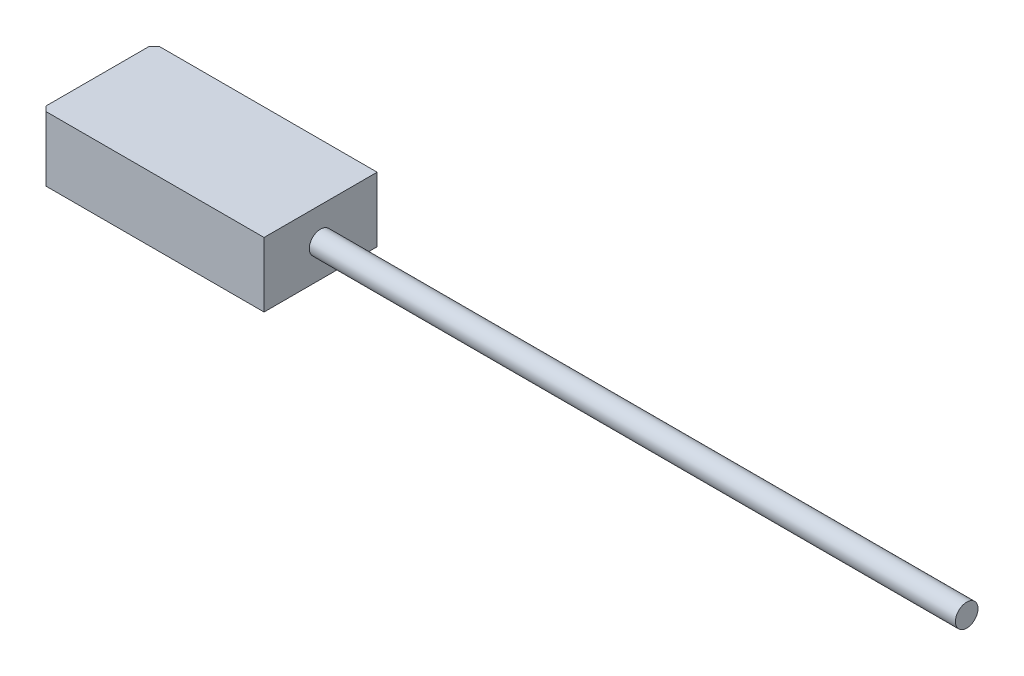
ISO-10303-21;
HEADER;
FILE_DESCRIPTION(('STEP AP214'),'2;1');
FILE_NAME('part.step','',(''),(''),'','','');
FILE_SCHEMA(('AUTOMOTIVE_DESIGN { 1 0 10303 214 1 1 1 1 }'));
ENDSEC;
DATA;
#1=APPLICATION_CONTEXT('core data for automotive mechanical design processes');
#2=APPLICATION_PROTOCOL_DEFINITION('international standard','automotive_design',2000,#1);
#3=PRODUCT_CONTEXT('',#1,'mechanical');
#4=PRODUCT('Part','Part','',(#3));
#5=PRODUCT_RELATED_PRODUCT_CATEGORY('part','',(#4));
#6=PRODUCT_DEFINITION_FORMATION('','',#4);
#7=PRODUCT_DEFINITION_CONTEXT('part definition',#1,'design');
#8=PRODUCT_DEFINITION('design','',#6,#7);
#9=PRODUCT_DEFINITION_SHAPE('','',#8);
#10=(LENGTH_UNIT() NAMED_UNIT(*) SI_UNIT(.MILLI.,.METRE.));
#11=(NAMED_UNIT(*) PLANE_ANGLE_UNIT() SI_UNIT($,.RADIAN.));
#12=(NAMED_UNIT(*) SI_UNIT($,.STERADIAN.) SOLID_ANGLE_UNIT());
#13=UNCERTAINTY_MEASURE_WITH_UNIT(LENGTH_MEASURE(1.E-05),#10,'distance_accuracy_value','');
#14=(GEOMETRIC_REPRESENTATION_CONTEXT(3) GLOBAL_UNCERTAINTY_ASSIGNED_CONTEXT((#13)) GLOBAL_UNIT_ASSIGNED_CONTEXT((#10,
#11,#12)) REPRESENTATION_CONTEXT('',''));
#15=CARTESIAN_POINT('',(0.,0.,0.));
#16=DIRECTION('',(0.,0.,1.));
#17=DIRECTION('',(1.,0.,0.));
#18=AXIS2_PLACEMENT_3D('',#15,#16,#17);
#19=CARTESIAN_POINT('',(1.5,-0.2,-0.35));
#20=DIRECTION('',(0.,0.,1.));
#21=DIRECTION('',(1.,0.,0.));
#22=AXIS2_PLACEMENT_3D('',#19,#20,#21);
#23=PLANE('',#22);
#24=DIRECTION('',(-1.,0.,0.));
#25=VECTOR('',#24,1.);
#26=CARTESIAN_POINT('',(1.5,-0.2,-0.35));
#27=LINE('',#26,#25);
#28=CARTESIAN_POINT('',(1.5,-0.2,-0.35));
#29=VERTEX_POINT('',#28);
#30=CARTESIAN_POINT('',(0.15,-0.2,-0.35));
#31=VERTEX_POINT('',#30);
#32=EDGE_CURVE('E210',#29,#31,#27,.T.);
#33=ORIENTED_EDGE('',*,*,#32,.T.);
#34=DIRECTION('',(0.,1.,0.));
#35=VECTOR('',#34,1.);
#36=CARTESIAN_POINT('',(0.15,0.0800000000000013,-0.35));
#37=LINE('',#36,#35);
#38=CARTESIAN_POINT('',(0.15,0.2,-0.35));
#39=VERTEX_POINT('',#38);
#40=EDGE_CURVE('E11',#31,#39,#37,.T.);
#41=ORIENTED_EDGE('',*,*,#40,.T.);
#42=DIRECTION('',(-1.,0.,0.));
#43=VECTOR('',#42,1.);
#44=CARTESIAN_POINT('',(1.5,0.2,-0.35));
#45=LINE('',#44,#43);
#46=CARTESIAN_POINT('',(1.5,0.2,-0.35));
#47=VERTEX_POINT('',#46);
#48=EDGE_CURVE('E117',#47,#39,#45,.T.);
#49=ORIENTED_EDGE('',*,*,#48,.F.);
#50=DIRECTION('',(0.,1.,0.));
#51=VECTOR('',#50,1.);
#52=CARTESIAN_POINT('',(1.5,-0.2,-0.35));
#53=LINE('',#52,#51);
#54=EDGE_CURVE('E124',#29,#47,#53,.T.);
#55=ORIENTED_EDGE('',*,*,#54,.F.);
#56=EDGE_LOOP('',(#33,#41,#49,#55));
#57=FACE_BOUND('',#56,.T.);
#58=ADVANCED_FACE('F44',(#57),#23,.F.);
#59=CARTESIAN_POINT('',(1.5,0.2,0.35));
#60=DIRECTION('',(0.,-1.,0.));
#61=DIRECTION('',(0.,0.,-1.));
#62=AXIS2_PLACEMENT_3D('',#59,#60,#61);
#63=PLANE('',#62);
#64=DIRECTION('',(0.,0.,1.));
#65=VECTOR('',#64,1.);
#66=CARTESIAN_POINT('',(0.119999999999999,0.2,0.35));
#67=LINE('',#66,#65);
#68=CARTESIAN_POINT('',(0.119999999999999,0.2,-0.319999999999998));
#69=VERTEX_POINT('',#68);
#70=CARTESIAN_POINT('',(0.119999999999999,0.2,0.319999999999998));
#71=VERTEX_POINT('',#70);
#72=EDGE_CURVE('E159',#69,#71,#67,.T.);
#73=ORIENTED_EDGE('',*,*,#72,.T.);
#74=DIRECTION('',(0.707106781186546,0.,0.70710678118655));
#75=VECTOR('',#74,1.);
#76=CARTESIAN_POINT('',(0.15,0.2,0.35));
#77=LINE('',#76,#75);
#78=CARTESIAN_POINT('',(0.15,0.2,0.35));
#79=VERTEX_POINT('',#78);
#80=EDGE_CURVE('E54',#71,#79,#77,.T.);
#81=ORIENTED_EDGE('',*,*,#80,.T.);
#82=DIRECTION('',(-1.,0.,0.));
#83=VECTOR('',#82,1.);
#84=CARTESIAN_POINT('',(1.5,0.2,0.35));
#85=LINE('',#84,#83);
#86=CARTESIAN_POINT('',(1.5,0.2,0.35));
#87=VERTEX_POINT('',#86);
#88=EDGE_CURVE('E119',#87,#79,#85,.T.);
#89=ORIENTED_EDGE('',*,*,#88,.F.);
#90=DIRECTION('',(0.,0.,1.));
#91=VECTOR('',#90,1.);
#92=CARTESIAN_POINT('',(1.5,0.2,0.35));
#93=LINE('',#92,#91);
#94=EDGE_CURVE('E113',#47,#87,#93,.T.);
#95=ORIENTED_EDGE('',*,*,#94,.F.);
#96=ORIENTED_EDGE('',*,*,#48,.T.);
#97=DIRECTION('',(-0.707106781186546,0.,0.70710678118655));
#98=VECTOR('',#97,1.);
#99=CARTESIAN_POINT('',(0.15,0.2,-0.35));
#100=LINE('',#99,#98);
#101=EDGE_CURVE('E61',#39,#69,#100,.T.);
#102=ORIENTED_EDGE('',*,*,#101,.T.);
#103=EDGE_LOOP('',(#73,#81,#89,#95,#96,#102));
#104=FACE_BOUND('',#103,.T.);
#105=ADVANCED_FACE('F115',(#104),#63,.F.);
#106=CARTESIAN_POINT('',(1.5,-0.2,0.35));
#107=DIRECTION('',(0.,0.,-1.));
#108=DIRECTION('',(-1.,0.,0.));
#109=AXIS2_PLACEMENT_3D('',#106,#107,#108);
#110=PLANE('',#109);
#111=ORIENTED_EDGE('',*,*,#88,.T.);
#112=DIRECTION('',(0.,-1.,0.));
#113=VECTOR('',#112,1.);
#114=CARTESIAN_POINT('',(0.15,-0.0800000000000005,0.35));
#115=LINE('',#114,#113);
#116=CARTESIAN_POINT('',(0.15,-0.2,0.35));
#117=VERTEX_POINT('',#116);
#118=EDGE_CURVE('E162',#79,#117,#115,.T.);
#119=ORIENTED_EDGE('',*,*,#118,.T.);
#120=DIRECTION('',(-1.,0.,0.));
#121=VECTOR('',#120,1.);
#122=CARTESIAN_POINT('',(1.5,-0.2,0.35));
#123=LINE('',#122,#121);
#124=CARTESIAN_POINT('',(1.5,-0.2,0.35));
#125=VERTEX_POINT('',#124);
#126=EDGE_CURVE('E144',#125,#117,#123,.T.);
#127=ORIENTED_EDGE('',*,*,#126,.F.);
#128=DIRECTION('',(0.,-1.,0.));
#129=VECTOR('',#128,1.);
#130=CARTESIAN_POINT('',(1.5,-0.2,0.35));
#131=LINE('',#130,#129);
#132=EDGE_CURVE('E123',#87,#125,#131,.T.);
#133=ORIENTED_EDGE('',*,*,#132,.F.);
#134=EDGE_LOOP('',(#111,#119,#127,#133));
#135=FACE_BOUND('',#134,.T.);
#136=ADVANCED_FACE('F195',(#135),#110,.F.);
#137=CARTESIAN_POINT('',(1.5,-0.2,0.35));
#138=DIRECTION('',(0.,1.,0.));
#139=DIRECTION('',(0.,0.,1.));
#140=AXIS2_PLACEMENT_3D('',#137,#138,#139);
#141=PLANE('',#140);
#142=ORIENTED_EDGE('',*,*,#126,.T.);
#143=DIRECTION('',(-0.707106781186546,0.,-0.70710678118655));
#144=VECTOR('',#143,1.);
#145=CARTESIAN_POINT('',(0.15,-0.2,0.35));
#146=LINE('',#145,#144);
#147=CARTESIAN_POINT('',(0.119999999999999,-0.2,0.319999999999999));
#148=VERTEX_POINT('',#147);
#149=EDGE_CURVE('E169',#117,#148,#146,.T.);
#150=ORIENTED_EDGE('',*,*,#149,.T.);
#151=DIRECTION('',(0.,0.,-1.));
#152=VECTOR('',#151,1.);
#153=CARTESIAN_POINT('',(0.119999999999999,-0.2,-0.35));
#154=LINE('',#153,#152);
#155=CARTESIAN_POINT('',(0.119999999999999,-0.2,-0.319999999999999));
#156=VERTEX_POINT('',#155);
#157=EDGE_CURVE('E142',#148,#156,#154,.T.);
#158=ORIENTED_EDGE('',*,*,#157,.T.);
#159=DIRECTION('',(0.707106781186546,0.,-0.70710678118655));
#160=VECTOR('',#159,1.);
#161=CARTESIAN_POINT('',(0.15,-0.2,-0.35));
#162=LINE('',#161,#160);
#163=EDGE_CURVE('E166',#156,#31,#162,.T.);
#164=ORIENTED_EDGE('',*,*,#163,.T.);
#165=ORIENTED_EDGE('',*,*,#32,.F.);
#166=DIRECTION('',(0.,0.,-1.));
#167=VECTOR('',#166,1.);
#168=CARTESIAN_POINT('',(1.5,-0.2,0.35));
#169=LINE('',#168,#167);
#170=EDGE_CURVE('E129',#125,#29,#169,.T.);
#171=ORIENTED_EDGE('',*,*,#170,.F.);
#172=EDGE_LOOP('',(#142,#150,#158,#164,#165,#171));
#173=FACE_BOUND('',#172,.T.);
#174=ADVANCED_FACE('F203',(#173),#141,.F.);
#175=CARTESIAN_POINT('',(1.5,0.,0.));
#176=DIRECTION('',(-1.,0.,0.));
#177=DIRECTION('',(0.,0.,1.));
#178=AXIS2_PLACEMENT_3D('',#175,#176,#177);
#179=PLANE('',#178);
#180=CARTESIAN_POINT('',(1.5,0.,0.));
#181=DIRECTION('',(1.,0.,0.));
#182=DIRECTION('',(0.,0.,-1.));
#183=AXIS2_PLACEMENT_3D('',#180,#181,#182);
#184=CIRCLE('',#183,0.07);
#185=CARTESIAN_POINT('',(1.5,0.,-0.07));
#186=VERTEX_POINT('',#185);
#187=EDGE_CURVE('E137',#186,#186,#184,.T.);
#188=ORIENTED_EDGE('',*,*,#187,.F.);
#189=EDGE_LOOP('',(#188));
#190=FACE_BOUND('',#189,.T.);
#191=ORIENTED_EDGE('',*,*,#54,.T.);
#192=ORIENTED_EDGE('',*,*,#94,.T.);
#193=ORIENTED_EDGE('',*,*,#132,.T.);
#194=ORIENTED_EDGE('',*,*,#170,.T.);
#195=EDGE_LOOP('',(#191,#192,#193,#194));
#196=FACE_BOUND('',#195,.T.);
#197=ADVANCED_FACE('F127',(#190,#196),#179,.F.);
#198=CARTESIAN_POINT('',(0.,0.,0.));
#199=DIRECTION('',(-1.,0.,0.));
#200=DIRECTION('',(0.,0.,1.));
#201=AXIS2_PLACEMENT_3D('',#198,#199,#200);
#202=PLANE('',#201);
#203=DIRECTION('',(0.,0.,1.));
#204=VECTOR('',#203,1.);
#205=CARTESIAN_POINT('',(0.,-0.0800000000000005,0.35));
#206=LINE('',#205,#204);
#207=CARTESIAN_POINT('',(0.,-0.0800000000000005,-0.199999999999999));
#208=VERTEX_POINT('',#207);
#209=CARTESIAN_POINT('',(0.,-0.0800000000000005,0.199999999999999));
#210=VERTEX_POINT('',#209);
#211=EDGE_CURVE('E155',#208,#210,#206,.T.);
#212=ORIENTED_EDGE('',*,*,#211,.T.);
#213=DIRECTION('',(0.,1.,0.));
#214=VECTOR('',#213,1.);
#215=CARTESIAN_POINT('',(0.,0.0800000000000013,0.199999999999999));
#216=LINE('',#215,#214);
#217=CARTESIAN_POINT('',(0.,0.0800000000000015,0.199999999999999));
#218=VERTEX_POINT('',#217);
#219=EDGE_CURVE('E181',#210,#218,#216,.T.);
#220=ORIENTED_EDGE('',*,*,#219,.T.);
#221=DIRECTION('',(0.,0.,-1.));
#222=VECTOR('',#221,1.);
#223=CARTESIAN_POINT('',(0.,0.0800000000000015,-0.35));
#224=LINE('',#223,#222);
#225=CARTESIAN_POINT('',(0.,0.0800000000000015,-0.199999999999999));
#226=VERTEX_POINT('',#225);
#227=EDGE_CURVE('E151',#218,#226,#224,.T.);
#228=ORIENTED_EDGE('',*,*,#227,.T.);
#229=DIRECTION('',(0.,-1.,0.));
#230=VECTOR('',#229,1.);
#231=CARTESIAN_POINT('',(0.,-0.0800000000000005,-0.199999999999999));
#232=LINE('',#231,#230);
#233=EDGE_CURVE('E178',#226,#208,#232,.T.);
#234=ORIENTED_EDGE('',*,*,#233,.T.);
#235=EDGE_LOOP('',(#212,#220,#228,#234));
#236=FACE_BOUND('',#235,.T.);
#237=ADVANCED_FACE('F228',(#236),#202,.T.);
#238=CARTESIAN_POINT('',(5.5,0.,0.));
#239=DIRECTION('',(-1.,0.,0.));
#240=DIRECTION('',(0.,0.,1.));
#241=AXIS2_PLACEMENT_3D('',#238,#239,#240);
#242=CYLINDRICAL_SURFACE('',#241,0.07);
#243=CARTESIAN_POINT('',(5.5,0.,0.));
#244=DIRECTION('',(1.,0.,0.));
#245=DIRECTION('',(0.,0.,-1.));
#246=AXIS2_PLACEMENT_3D('',#243,#244,#245);
#247=CIRCLE('',#246,0.07);
#248=CARTESIAN_POINT('',(5.5,0.,-0.07));
#249=VERTEX_POINT('',#248);
#250=EDGE_CURVE('E134',#249,#249,#247,.T.);
#251=ORIENTED_EDGE('',*,*,#250,.F.);
#252=EDGE_LOOP('',(#251));
#253=FACE_BOUND('',#252,.T.);
#254=ORIENTED_EDGE('',*,*,#187,.T.);
#255=EDGE_LOOP('',(#254));
#256=FACE_BOUND('',#255,.T.);
#257=ADVANCED_FACE('F225',(#253,#256),#242,.T.);
#258=CARTESIAN_POINT('',(5.5,0.,0.));
#259=DIRECTION('',(1.,0.,0.));
#260=DIRECTION('',(0.,0.,-1.));
#261=AXIS2_PLACEMENT_3D('',#258,#259,#260);
#262=PLANE('',#261);
#263=ORIENTED_EDGE('',*,*,#250,.T.);
#264=EDGE_LOOP('',(#263));
#265=FACE_BOUND('',#264,.T.);
#266=ADVANCED_FACE('F223',(#265),#262,.T.);
#267=CARTESIAN_POINT('',(0.119999999999999,-0.2,0.35));
#268=DIRECTION('',(-0.707106781186547,-0.707106781186547,0.));
#269=DIRECTION('',(0.,0.,1.));
#270=AXIS2_PLACEMENT_3D('',#267,#268,#269);
#271=PLANE('',#270);
#272=ORIENTED_EDGE('',*,*,#157,.F.);
#273=DIRECTION('',(-0.577350269189625,0.577350269189625,-0.577350269189628));
#274=VECTOR('',#273,1.);
#275=CARTESIAN_POINT('',(0.13,-0.21,0.33));
#276=LINE('',#275,#274);
#277=EDGE_CURVE('E175',#148,#210,#276,.T.);
#278=ORIENTED_EDGE('',*,*,#277,.T.);
#279=ORIENTED_EDGE('',*,*,#211,.F.);
#280=DIRECTION('',(0.577350269189625,-0.577350269189625,-0.577350269189628));
#281=VECTOR('',#280,1.);
#282=CARTESIAN_POINT('',(-0.103333333333334,0.0233333333333336,-0.0966666666666645));
#283=LINE('',#282,#281);
#284=EDGE_CURVE('E172',#208,#156,#283,.T.);
#285=ORIENTED_EDGE('',*,*,#284,.T.);
#286=EDGE_LOOP('',(#272,#278,#279,#285));
#287=FACE_BOUND('',#286,.T.);
#288=ADVANCED_FACE('F206',(#287),#271,.T.);
#289=CARTESIAN_POINT('',(0.119999999999999,0.2,0.35));
#290=DIRECTION('',(-0.707106781186548,0.707106781186548,0.));
#291=DIRECTION('',(0.,0.,-1.));
#292=AXIS2_PLACEMENT_3D('',#289,#290,#291);
#293=PLANE('',#292);
#294=ORIENTED_EDGE('',*,*,#227,.F.);
#295=DIRECTION('',(0.577350269189625,0.577350269189625,0.577350269189628));
#296=VECTOR('',#295,1.);
#297=CARTESIAN_POINT('',(0.129999999999999,0.210000000000001,0.329999999999999));
#298=LINE('',#297,#296);
#299=EDGE_CURVE('E68',#218,#71,#298,.T.);
#300=ORIENTED_EDGE('',*,*,#299,.T.);
#301=ORIENTED_EDGE('',*,*,#72,.F.);
#302=DIRECTION('',(-0.577350269189625,-0.577350269189625,0.577350269189628));
#303=VECTOR('',#302,1.);
#304=CARTESIAN_POINT('',(-0.103333333333335,-0.0233333333333332,-0.0966666666666639));
#305=LINE('',#304,#303);
#306=EDGE_CURVE('E184',#69,#226,#305,.T.);
#307=ORIENTED_EDGE('',*,*,#306,.T.);
#308=EDGE_LOOP('',(#294,#300,#301,#307));
#309=FACE_BOUND('',#308,.T.);
#310=ADVANCED_FACE('F255',(#309),#293,.T.);
#311=CARTESIAN_POINT('',(0.15,-0.2,0.35));
#312=DIRECTION('',(-0.70710678118655,0.,0.707106781186546));
#313=DIRECTION('',(0.,1.,0.));
#314=AXIS2_PLACEMENT_3D('',#311,#312,#313);
#315=PLANE('',#314);
#316=ORIENTED_EDGE('',*,*,#299,.F.);
#317=ORIENTED_EDGE('',*,*,#219,.F.);
#318=ORIENTED_EDGE('',*,*,#277,.F.);
#319=ORIENTED_EDGE('',*,*,#149,.F.);
#320=ORIENTED_EDGE('',*,*,#118,.F.);
#321=ORIENTED_EDGE('',*,*,#80,.F.);
#322=EDGE_LOOP('',(#316,#317,#318,#319,#320,#321));
#323=FACE_BOUND('',#322,.T.);
#324=ADVANCED_FACE('F198',(#323),#315,.T.);
#325=CARTESIAN_POINT('',(0.15,-0.2,-0.35));
#326=DIRECTION('',(-0.70710678118655,0.,-0.707106781186546));
#327=DIRECTION('',(0.,-1.,0.));
#328=AXIS2_PLACEMENT_3D('',#325,#326,#327);
#329=PLANE('',#328);
#330=ORIENTED_EDGE('',*,*,#284,.F.);
#331=ORIENTED_EDGE('',*,*,#233,.F.);
#332=ORIENTED_EDGE('',*,*,#306,.F.);
#333=ORIENTED_EDGE('',*,*,#101,.F.);
#334=ORIENTED_EDGE('',*,*,#40,.F.);
#335=ORIENTED_EDGE('',*,*,#163,.F.);
#336=EDGE_LOOP('',(#330,#331,#332,#333,#334,#335));
#337=FACE_BOUND('',#336,.T.);
#338=ADVANCED_FACE('F47',(#337),#329,.T.);
#339=CLOSED_SHELL('',(#58,#105,#136,#174,#197,#237,#257,#266,#288,#310,#324,#338));
#340=MANIFOLD_SOLID_BREP('B2',#339);
#341=ADVANCED_BREP_SHAPE_REPRESENTATION('',(#18,#340),#14);
#342=SHAPE_DEFINITION_REPRESENTATION(#9,#341);
ENDSEC;
END-ISO-10303-21;
